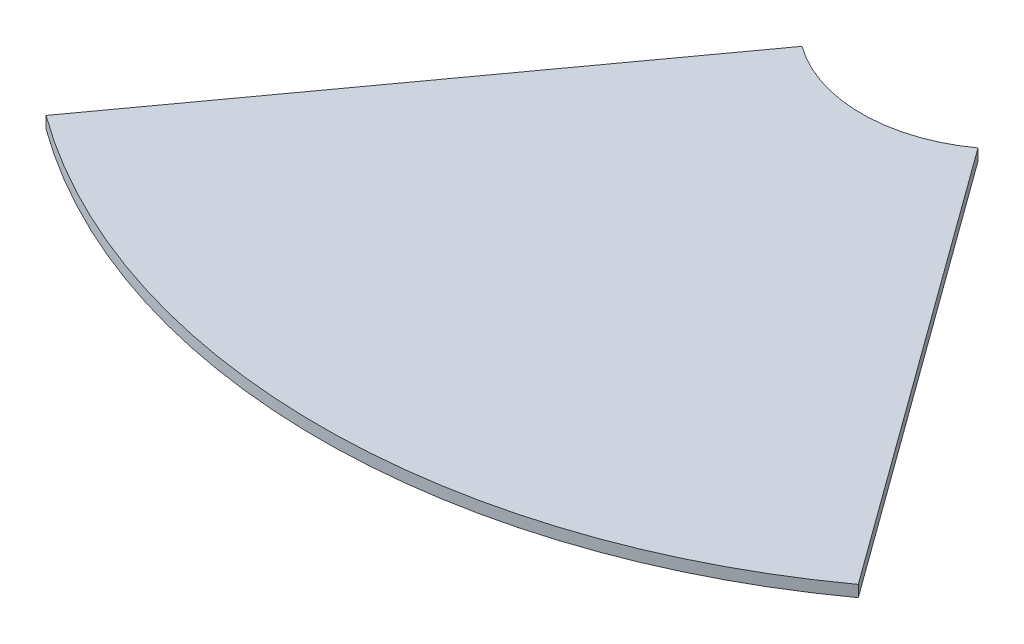
ISO-10303-21;
HEADER;
FILE_DESCRIPTION(('STEP AP214'),'2;1');
FILE_NAME('part.step','',(''),(''),'','','');
FILE_SCHEMA(('AUTOMOTIVE_DESIGN { 1 0 10303 214 1 1 1 1 }'));
ENDSEC;
DATA;
#1=APPLICATION_CONTEXT('core data for automotive mechanical design processes');
#2=APPLICATION_PROTOCOL_DEFINITION('international standard','automotive_design',2000,#1);
#3=PRODUCT_CONTEXT('',#1,'mechanical');
#4=PRODUCT('Part','Part','',(#3));
#5=PRODUCT_RELATED_PRODUCT_CATEGORY('part','',(#4));
#6=PRODUCT_DEFINITION_FORMATION('','',#4);
#7=PRODUCT_DEFINITION_CONTEXT('part definition',#1,'design');
#8=PRODUCT_DEFINITION('design','',#6,#7);
#9=PRODUCT_DEFINITION_SHAPE('','',#8);
#10=(LENGTH_UNIT() NAMED_UNIT(*) SI_UNIT(.MILLI.,.METRE.));
#11=(NAMED_UNIT(*) PLANE_ANGLE_UNIT() SI_UNIT($,.RADIAN.));
#12=(NAMED_UNIT(*) SI_UNIT($,.STERADIAN.) SOLID_ANGLE_UNIT());
#13=UNCERTAINTY_MEASURE_WITH_UNIT(LENGTH_MEASURE(1.E-05),#10,'distance_accuracy_value','');
#14=(GEOMETRIC_REPRESENTATION_CONTEXT(3) GLOBAL_UNCERTAINTY_ASSIGNED_CONTEXT((#13)) GLOBAL_UNIT_ASSIGNED_CONTEXT((#10,
#11,#12)) REPRESENTATION_CONTEXT('',''));
#15=CARTESIAN_POINT('',(0.,0.,0.));
#16=DIRECTION('',(0.,0.,1.));
#17=DIRECTION('',(1.,0.,0.));
#18=AXIS2_PLACEMENT_3D('',#15,#16,#17);
#19=CARTESIAN_POINT('',(0.,5.,0.));
#20=DIRECTION('',(0.,-1.,0.));
#21=DIRECTION('',(0.,0.,-1.));
#22=AXIS2_PLACEMENT_3D('',#19,#20,#21);
#23=CYLINDRICAL_SURFACE('',#22,65.);
#24=CARTESIAN_POINT('',(0.,0.,0.));
#25=DIRECTION('',(0.,-1.,0.));
#26=DIRECTION('',(0.,0.,1.));
#27=AXIS2_PLACEMENT_3D('',#24,#25,#26);
#28=CIRCLE('',#27,65.);
#29=CARTESIAN_POINT('',(38.2060413990105,0.,52.5861046343718));
#30=VERTEX_POINT('',#29);
#31=CARTESIAN_POINT('',(-38.2060413990112,0.,52.5861046343713));
#32=VERTEX_POINT('',#31);
#33=EDGE_CURVE('E107',#30,#32,#28,.T.);
#34=ORIENTED_EDGE('',*,*,#33,.T.);
#35=DIRECTION('',(0.,-1.,0.));
#36=VECTOR('',#35,1.);
#37=CARTESIAN_POINT('',(-38.2060413990112,5.,52.5861046343713));
#38=LINE('',#37,#36);
#39=CARTESIAN_POINT('',(-38.2060413990112,5.,52.5861046343713));
#40=VERTEX_POINT('',#39);
#41=EDGE_CURVE('E11',#40,#32,#38,.T.);
#42=ORIENTED_EDGE('',*,*,#41,.F.);
#43=CARTESIAN_POINT('',(0.,5.,0.));
#44=DIRECTION('',(0.,-1.,0.));
#45=DIRECTION('',(0.,0.,1.));
#46=AXIS2_PLACEMENT_3D('',#43,#44,#45);
#47=CIRCLE('',#46,65.);
#48=CARTESIAN_POINT('',(38.2060413990105,5.,52.5861046343718));
#49=VERTEX_POINT('',#48);
#50=EDGE_CURVE('E91',#49,#40,#47,.T.);
#51=ORIENTED_EDGE('',*,*,#50,.F.);
#52=DIRECTION('',(0.,-1.,0.));
#53=VECTOR('',#52,1.);
#54=CARTESIAN_POINT('',(38.2060413990105,5.,52.5861046343718));
#55=LINE('',#54,#53);
#56=EDGE_CURVE('E103',#49,#30,#55,.T.);
#57=ORIENTED_EDGE('',*,*,#56,.T.);
#58=EDGE_LOOP('',(#34,#42,#51,#57));
#59=FACE_BOUND('',#58,.T.);
#60=ADVANCED_FACE('F39',(#59),#23,.F.);
#61=CARTESIAN_POINT('',(-38.2060413990112,5.,52.5861046343713));
#62=DIRECTION('',(0.809016994374942,0.,0.58778525229248));
#63=DIRECTION('',(0.58778525229248,0.,-0.809016994374942));
#64=AXIS2_PLACEMENT_3D('',#61,#62,#63);
#65=PLANE('',#64);
#66=DIRECTION('',(-0.58778525229248,0.,0.809016994374942));
#67=VECTOR('',#66,1.);
#68=CARTESIAN_POINT('',(-38.2060413990112,0.,52.5861046343713));
#69=LINE('',#68,#67);
#70=CARTESIAN_POINT('',(-176.335575687744,0.,242.705098312483));
#71=VERTEX_POINT('',#70);
#72=EDGE_CURVE('E96',#32,#71,#69,.T.);
#73=ORIENTED_EDGE('',*,*,#72,.T.);
#74=DIRECTION('',(0.,-1.,0.));
#75=VECTOR('',#74,1.);
#76=CARTESIAN_POINT('',(-176.335575687744,5.,242.705098312483));
#77=LINE('',#76,#75);
#78=CARTESIAN_POINT('',(-176.335575687744,5.,242.705098312483));
#79=VERTEX_POINT('',#78);
#80=EDGE_CURVE('E48',#79,#71,#77,.T.);
#81=ORIENTED_EDGE('',*,*,#80,.F.);
#82=DIRECTION('',(-0.58778525229248,0.,0.809016994374942));
#83=VECTOR('',#82,1.);
#84=CARTESIAN_POINT('',(-38.2060413990112,5.,52.5861046343713));
#85=LINE('',#84,#83);
#86=EDGE_CURVE('E86',#40,#79,#85,.T.);
#87=ORIENTED_EDGE('',*,*,#86,.F.);
#88=ORIENTED_EDGE('',*,*,#41,.T.);
#89=EDGE_LOOP('',(#73,#81,#87,#88));
#90=FACE_BOUND('',#89,.T.);
#91=ADVANCED_FACE('F95',(#90),#65,.F.);
#92=CARTESIAN_POINT('',(0.,5.,0.));
#93=DIRECTION('',(0.,-1.,0.));
#94=DIRECTION('',(0.,0.,-1.));
#95=AXIS2_PLACEMENT_3D('',#92,#93,#94);
#96=CYLINDRICAL_SURFACE('',#95,300.);
#97=CARTESIAN_POINT('',(0.,0.,0.));
#98=DIRECTION('',(0.,1.,0.));
#99=DIRECTION('',(0.,0.,1.));
#100=AXIS2_PLACEMENT_3D('',#97,#98,#99);
#101=CIRCLE('',#100,300.);
#102=CARTESIAN_POINT('',(176.335575687741,0.,242.705098312485));
#103=VERTEX_POINT('',#102);
#104=EDGE_CURVE('E73',#71,#103,#101,.T.);
#105=ORIENTED_EDGE('',*,*,#104,.T.);
#106=DIRECTION('',(0.,-1.,0.));
#107=VECTOR('',#106,1.);
#108=CARTESIAN_POINT('',(176.335575687741,5.,242.705098312485));
#109=LINE('',#108,#107);
#110=CARTESIAN_POINT('',(176.335575687741,5.,242.705098312485));
#111=VERTEX_POINT('',#110);
#112=EDGE_CURVE('E98',#111,#103,#109,.T.);
#113=ORIENTED_EDGE('',*,*,#112,.F.);
#114=CARTESIAN_POINT('',(0.,5.,0.));
#115=DIRECTION('',(0.,1.,0.));
#116=DIRECTION('',(0.,0.,1.));
#117=AXIS2_PLACEMENT_3D('',#114,#115,#116);
#118=CIRCLE('',#117,300.);
#119=EDGE_CURVE('E89',#79,#111,#118,.T.);
#120=ORIENTED_EDGE('',*,*,#119,.F.);
#121=ORIENTED_EDGE('',*,*,#80,.T.);
#122=EDGE_LOOP('',(#105,#113,#120,#121));
#123=FACE_BOUND('',#122,.T.);
#124=ADVANCED_FACE('F99',(#123),#96,.T.);
#125=CARTESIAN_POINT('',(38.2060413990105,5.,52.5861046343718));
#126=DIRECTION('',(-0.809016994374951,0.,0.587785252292468));
#127=DIRECTION('',(0.587785252292468,0.,0.809016994374951));
#128=AXIS2_PLACEMENT_3D('',#125,#126,#127);
#129=PLANE('',#128);
#130=DIRECTION('',(-0.587785252292468,0.,-0.809016994374951));
#131=VECTOR('',#130,1.);
#132=CARTESIAN_POINT('',(38.2060413990105,0.,52.5861046343718));
#133=LINE('',#132,#131);
#134=EDGE_CURVE('E79',#103,#30,#133,.T.);
#135=ORIENTED_EDGE('',*,*,#134,.T.);
#136=ORIENTED_EDGE('',*,*,#56,.F.);
#137=DIRECTION('',(-0.587785252292468,0.,-0.809016994374951));
#138=VECTOR('',#137,1.);
#139=CARTESIAN_POINT('',(38.2060413990105,5.,52.5861046343718));
#140=LINE('',#139,#138);
#141=EDGE_CURVE('E56',#111,#49,#140,.T.);
#142=ORIENTED_EDGE('',*,*,#141,.F.);
#143=ORIENTED_EDGE('',*,*,#112,.T.);
#144=EDGE_LOOP('',(#135,#136,#142,#143));
#145=FACE_BOUND('',#144,.T.);
#146=ADVANCED_FACE('F120',(#145),#129,.F.);
#147=CARTESIAN_POINT('',(0.,5.,0.));
#148=DIRECTION('',(0.,1.,0.));
#149=DIRECTION('',(0.,0.,1.));
#150=AXIS2_PLACEMENT_3D('',#147,#148,#149);
#151=PLANE('',#150);
#152=ORIENTED_EDGE('',*,*,#50,.T.);
#153=ORIENTED_EDGE('',*,*,#86,.T.);
#154=ORIENTED_EDGE('',*,*,#119,.T.);
#155=ORIENTED_EDGE('',*,*,#141,.T.);
#156=EDGE_LOOP('',(#152,#153,#154,#155));
#157=FACE_BOUND('',#156,.T.);
#158=ADVANCED_FACE('F87',(#157),#151,.T.);
#159=CARTESIAN_POINT('',(0.,0.,0.));
#160=DIRECTION('',(0.,1.,0.));
#161=DIRECTION('',(0.,0.,1.));
#162=AXIS2_PLACEMENT_3D('',#159,#160,#161);
#163=PLANE('',#162);
#164=ORIENTED_EDGE('',*,*,#33,.F.);
#165=ORIENTED_EDGE('',*,*,#134,.F.);
#166=ORIENTED_EDGE('',*,*,#104,.F.);
#167=ORIENTED_EDGE('',*,*,#72,.F.);
#168=EDGE_LOOP('',(#164,#165,#166,#167));
#169=FACE_BOUND('',#168,.T.);
#170=ADVANCED_FACE('F123',(#169),#163,.F.);
#171=CLOSED_SHELL('',(#60,#91,#124,#146,#158,#170));
#172=MANIFOLD_SOLID_BREP('B2',#171);
#173=ADVANCED_BREP_SHAPE_REPRESENTATION('',(#18,#172),#14);
#174=SHAPE_DEFINITION_REPRESENTATION(#9,#173);
ENDSEC;
END-ISO-10303-21;
